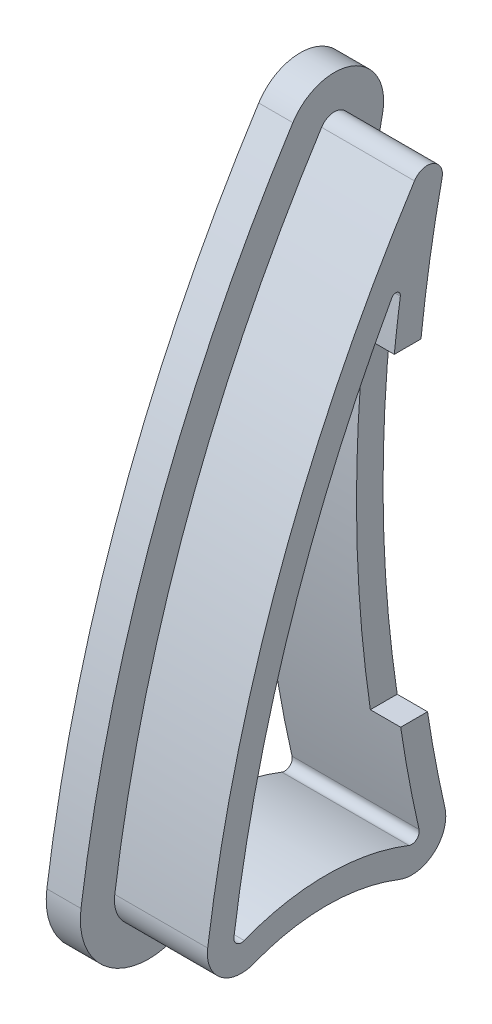
ISO-10303-21;
HEADER;
FILE_DESCRIPTION(('STEP AP214'),'2;1');
FILE_NAME('part.step','',(''),(''),'','','');
FILE_SCHEMA(('AUTOMOTIVE_DESIGN { 1 0 10303 214 1 1 1 1 }'));
ENDSEC;
DATA;
#1=APPLICATION_CONTEXT('core data for automotive mechanical design processes');
#2=APPLICATION_PROTOCOL_DEFINITION('international standard','automotive_design',2000,#1);
#3=PRODUCT_CONTEXT('',#1,'mechanical');
#4=PRODUCT('Part','Part','',(#3));
#5=PRODUCT_RELATED_PRODUCT_CATEGORY('part','',(#4));
#6=PRODUCT_DEFINITION_FORMATION('','',#4);
#7=PRODUCT_DEFINITION_CONTEXT('part definition',#1,'design');
#8=PRODUCT_DEFINITION('design','',#6,#7);
#9=PRODUCT_DEFINITION_SHAPE('','',#8);
#10=(LENGTH_UNIT() NAMED_UNIT(*) SI_UNIT(.MILLI.,.METRE.));
#11=(NAMED_UNIT(*) PLANE_ANGLE_UNIT() SI_UNIT($,.RADIAN.));
#12=(NAMED_UNIT(*) SI_UNIT($,.STERADIAN.) SOLID_ANGLE_UNIT());
#13=UNCERTAINTY_MEASURE_WITH_UNIT(LENGTH_MEASURE(1.E-05),#10,'distance_accuracy_value','');
#14=(GEOMETRIC_REPRESENTATION_CONTEXT(3) GLOBAL_UNCERTAINTY_ASSIGNED_CONTEXT((#13)) GLOBAL_UNIT_ASSIGNED_CONTEXT((#10,
#11,#12)) REPRESENTATION_CONTEXT('',''));
#15=CARTESIAN_POINT('',(0.,0.,0.));
#16=DIRECTION('',(0.,0.,1.));
#17=DIRECTION('',(1.,0.,0.));
#18=AXIS2_PLACEMENT_3D('',#15,#16,#17);
#19=CARTESIAN_POINT('',(0.,-6.20177657240364,-184.198856021998));
#20=DIRECTION('',(-1.,0.,0.));
#21=DIRECTION('',(0.,0.,-1.));
#22=AXIS2_PLACEMENT_3D('',#19,#20,#21);
#23=CYLINDRICAL_SURFACE('',#22,210.385678361767);
#24=CARTESIAN_POINT('',(-5.08,-6.20177657240364,-184.198856021998));
#25=DIRECTION('',(1.,0.,0.));
#26=DIRECTION('',(0.,0.,-1.));
#27=AXIS2_PLACEMENT_3D('',#24,#25,#26);
#28=CIRCLE('',#27,210.385678361767);
#29=CARTESIAN_POINT('',(-5.08,16.9330409285443,24.9109569446311));
#30=VERTEX_POINT('',#29);
#31=CARTESIAN_POINT('',(-5.08,-37.6769590714556,23.8190435597259));
#32=VERTEX_POINT('',#31);
#33=EDGE_CURVE('E331',#30,#32,#28,.T.);
#34=ORIENTED_EDGE('',*,*,#33,.T.);
#35=DIRECTION('',(-1.,0.,0.));
#36=VECTOR('',#35,1.);
#37=CARTESIAN_POINT('',(0.,-37.6769590714556,23.8190435597258));
#38=LINE('',#37,#36);
#39=CARTESIAN_POINT('',(0.,-37.6769590714556,23.8190435597259));
#40=VERTEX_POINT('',#39);
#41=EDGE_CURVE('E328',#40,#32,#38,.T.);
#42=ORIENTED_EDGE('',*,*,#41,.F.);
#43=CARTESIAN_POINT('',(0.,-6.20177657240364,-184.198856021998));
#44=DIRECTION('',(-1.,0.,0.));
#45=DIRECTION('',(0.,0.,-1.));
#46=AXIS2_PLACEMENT_3D('',#43,#44,#45);
#47=CIRCLE('',#46,210.385678361767);
#48=CARTESIAN_POINT('',(0.,-53.0579844312768,20.9026540768476));
#49=VERTEX_POINT('',#48);
#50=EDGE_CURVE('E247',#49,#40,#47,.T.);
#51=ORIENTED_EDGE('',*,*,#50,.F.);
#52=DIRECTION('',(-1.,0.,0.));
#53=VECTOR('',#52,1.);
#54=CARTESIAN_POINT('',(0.,-53.0579844312768,20.9026540768476));
#55=LINE('',#54,#53);
#56=CARTESIAN_POINT('',(-15.5575,-53.0579844312768,20.9026540768476));
#57=VERTEX_POINT('',#56);
#58=EDGE_CURVE('E285',#49,#57,#55,.T.);
#59=ORIENTED_EDGE('',*,*,#58,.T.);
#60=CARTESIAN_POINT('',(-15.5575,-6.20177657240364,-184.198856021998));
#61=DIRECTION('',(-1.,0.,0.));
#62=DIRECTION('',(0.,0.,-1.));
#63=AXIS2_PLACEMENT_3D('',#60,#61,#62);
#64=CIRCLE('',#63,210.385678361767);
#65=CARTESIAN_POINT('',(-15.5575,38.5039666862931,21.3821017037317));
#66=VERTEX_POINT('',#65);
#67=EDGE_CURVE('E270',#57,#66,#64,.T.);
#68=ORIENTED_EDGE('',*,*,#67,.T.);
#69=DIRECTION('',(-1.,0.,0.));
#70=VECTOR('',#69,1.);
#71=CARTESIAN_POINT('',(0.,38.5039666862931,21.3821017037317));
#72=LINE('',#71,#70);
#73=CARTESIAN_POINT('',(0.,38.5039666862931,21.3821017037317));
#74=VERTEX_POINT('',#73);
#75=EDGE_CURVE('E281',#74,#66,#72,.T.);
#76=ORIENTED_EDGE('',*,*,#75,.F.);
#77=CARTESIAN_POINT('',(0.,16.9330409285443,24.9109569446311));
#78=VERTEX_POINT('',#77);
#79=EDGE_CURVE('E246',#78,#74,#47,.T.);
#80=ORIENTED_EDGE('',*,*,#79,.F.);
#81=DIRECTION('',(-1.,0.,0.));
#82=VECTOR('',#81,1.);
#83=CARTESIAN_POINT('',(0.,16.9330409285443,24.9109569446311));
#84=LINE('',#83,#82);
#85=EDGE_CURVE('E324',#30,#78,#84,.F.);
#86=ORIENTED_EDGE('',*,*,#85,.F.);
#87=EDGE_LOOP('',(#34,#42,#51,#59,#68,#76,#80,#86));
#88=FACE_BOUND('',#87,.T.);
#89=ADVANCED_FACE('F44',(#88),#23,.F.);
#90=CARTESIAN_POINT('',(0.,-70.0279025216978,-58.2002153134541));
#91=DIRECTION('',(-1.,0.,0.));
#92=DIRECTION('',(0.,0.,-1.));
#93=AXIS2_PLACEMENT_3D('',#90,#91,#92);
#94=PLANE('',#93);
#95=DIRECTION('',(0.,0.,1.));
#96=VECTOR('',#95,1.);
#97=CARTESIAN_POINT('',(0.,16.9330409285443,11.4890333887427));
#98=LINE('',#97,#96);
#99=CARTESIAN_POINT('',(0.,16.9330409285443,29.3825115749315));
#100=VERTEX_POINT('',#99);
#101=EDGE_CURVE('E345',#78,#100,#98,.T.);
#102=ORIENTED_EDGE('',*,*,#101,.F.);
#103=ORIENTED_EDGE('',*,*,#79,.T.);
#104=CARTESIAN_POINT('',(0.,39.0437020369182,23.8640939984993));
#105=DIRECTION('',(1.,0.,0.));
#106=DIRECTION('',(0.,0.,-1.));
#107=AXIS2_PLACEMENT_3D('',#104,#105,#106);
#108=CIRCLE('',#107,2.54);
#109=CARTESIAN_POINT('',(0.,40.4114208380215,26.0044082934355));
#110=VERTEX_POINT('',#109);
#111=EDGE_CURVE('E251',#74,#110,#108,.T.);
#112=ORIENTED_EDGE('',*,*,#111,.T.);
#113=CARTESIAN_POINT('',(0.,-85.725,-171.383815377929));
#114=DIRECTION('',(1.,0.,0.));
#115=DIRECTION('',(0.,0.,-1.));
#116=AXIS2_PLACEMENT_3D('',#113,#114,#115);
#117=CIRCLE('',#116,234.248815377929);
#118=CARTESIAN_POINT('',(0.,-53.5457228712878,60.6442036832107));
#119=VERTEX_POINT('',#118);
#120=EDGE_CURVE('E230',#110,#119,#117,.T.);
#121=ORIENTED_EDGE('',*,*,#120,.T.);
#122=CARTESIAN_POINT('',(0.,-54.3308050433957,54.9833847510209));
#123=DIRECTION('',(1.,0.,0.));
#124=DIRECTION('',(0.,0.,-1.));
#125=AXIS2_PLACEMENT_3D('',#122,#123,#124);
#126=CIRCLE('',#125,5.715);
#127=CARTESIAN_POINT('',(0.,-59.6454053940841,52.8818976317499));
#128=VERTEX_POINT('',#127);
#129=EDGE_CURVE('E234',#119,#128,#126,.T.);
#130=ORIENTED_EDGE('',*,*,#129,.T.);
#131=CARTESIAN_POINT('',(0.,-90.380368501444,40.7287487928118));
#132=DIRECTION('',(-1.,0.,0.));
#133=DIRECTION('',(0.,0.,-1.));
#134=AXIS2_PLACEMENT_3D('',#131,#132,#133);
#135=CIRCLE('',#134,33.050521688956);
#136=CARTESIAN_POINT('',(0.,-59.6454053940841,28.5755999538737));
#137=VERTEX_POINT('',#136);
#138=EDGE_CURVE('E239',#128,#137,#135,.T.);
#139=ORIENTED_EDGE('',*,*,#138,.T.);
#140=CARTESIAN_POINT('',(0.,-54.3308050433957,26.4741128346026));
#141=DIRECTION('',(1.,0.,0.));
#142=DIRECTION('',(0.,0.,-1.));
#143=AXIS2_PLACEMENT_3D('',#140,#141,#142);
#144=CIRCLE('',#143,5.715);
#145=EDGE_CURVE('E243',#137,#49,#144,.T.);
#146=ORIENTED_EDGE('',*,*,#145,.T.);
#147=ORIENTED_EDGE('',*,*,#50,.T.);
#148=DIRECTION('',(0.,0.,-1.));
#149=VECTOR('',#148,1.);
#150=CARTESIAN_POINT('',(0.,-37.6769590714556,10.3217925721392));
#151=LINE('',#150,#149);
#152=CARTESIAN_POINT('',(0.,-37.6769590714555,28.3135747956562));
#153=VERTEX_POINT('',#152);
#154=EDGE_CURVE('E341',#153,#40,#151,.T.);
#155=ORIENTED_EDGE('',*,*,#154,.F.);
#156=CARTESIAN_POINT('',(0.,-6.20177657240364,-184.198856021998));
#157=DIRECTION('',(-1.,0.,0.));
#158=DIRECTION('',(0.,0.,-1.));
#159=AXIS2_PLACEMENT_3D('',#156,#157,#158);
#160=CIRCLE('',#159,214.830678361767);
#161=CARTESIAN_POINT('',(0.,-54.0479560184804,25.2360108884348));
#162=VERTEX_POINT('',#161);
#163=EDGE_CURVE('E219',#162,#153,#160,.T.);
#164=ORIENTED_EDGE('',*,*,#163,.F.);
#165=CARTESIAN_POINT('',(0.,-54.3308050433957,26.4741128346026));
#166=DIRECTION('',(1.,0.,0.));
#167=DIRECTION('',(0.,0.,-1.));
#168=AXIS2_PLACEMENT_3D('',#165,#166,#167);
#169=CIRCLE('',#168,1.27);
#170=CARTESIAN_POINT('',(0.,-55.5118273435487,26.9411099722184));
#171=VERTEX_POINT('',#170);
#172=EDGE_CURVE('E312',#171,#162,#169,.T.);
#173=ORIENTED_EDGE('',*,*,#172,.F.);
#174=CARTESIAN_POINT('',(0.,-90.380368501444,40.7287487928118));
#175=DIRECTION('',(-1.,0.,0.));
#176=DIRECTION('',(0.,0.,-1.));
#177=AXIS2_PLACEMENT_3D('',#174,#175,#176);
#178=CIRCLE('',#177,37.495521688956);
#179=CARTESIAN_POINT('',(0.,-55.5118273435487,54.5163876134051));
#180=VERTEX_POINT('',#179);
#181=EDGE_CURVE('E316',#180,#171,#178,.T.);
#182=ORIENTED_EDGE('',*,*,#181,.F.);
#183=CARTESIAN_POINT('',(0.,-54.3308050433957,54.9833847510209));
#184=DIRECTION('',(1.,0.,0.));
#185=DIRECTION('',(0.,0.,-1.));
#186=AXIS2_PLACEMENT_3D('',#183,#184,#185);
#187=CIRCLE('',#186,1.27);
#188=CARTESIAN_POINT('',(0.,-54.1563423384828,56.2413445137298));
#189=VERTEX_POINT('',#188);
#190=EDGE_CURVE('E319',#189,#180,#187,.T.);
#191=ORIENTED_EDGE('',*,*,#190,.F.);
#192=CARTESIAN_POINT('',(0.,-85.725,-171.383815377929));
#193=DIRECTION('',(1.,0.,0.));
#194=DIRECTION('',(0.,0.,-1.));
#195=AXIS2_PLACEMENT_3D('',#192,#193,#194);
#196=CIRCLE('',#195,229.803815377929);
#197=CARTESIAN_POINT('',(0.,25.3482363803248,29.794040566143));
#198=VERTEX_POINT('',#197);
#199=EDGE_CURVE('E216',#198,#189,#196,.T.);
#200=ORIENTED_EDGE('',*,*,#199,.F.);
#201=CARTESIAN_POINT('',(0.,24.9799317636994,29.1269605789057));
#202=DIRECTION('',(1.,0.,0.));
#203=DIRECTION('',(0.,0.,-1.));
#204=AXIS2_PLACEMENT_3D('',#201,#202,#203);
#205=CIRCLE('',#204,0.762);
#206=CARTESIAN_POINT('',(0.,24.8697217976994,28.3729726722427));
#207=VERTEX_POINT('',#206);
#208=EDGE_CURVE('E11',#207,#198,#205,.T.);
#209=ORIENTED_EDGE('',*,*,#208,.F.);
#210=EDGE_CURVE('E226',#100,#207,#160,.T.);
#211=ORIENTED_EDGE('',*,*,#210,.F.);
#212=EDGE_LOOP('',(#102,#103,#112,#121,#130,#139,#146,#147,#155,#164,#173,#182,#191,#200,#209,#211));
#213=FACE_BOUND('',#212,.T.);
#214=ADVANCED_FACE('F445',(#213),#94,.F.);
#215=CARTESIAN_POINT('',(0.,-6.20177657240364,-184.198856021998));
#216=DIRECTION('',(-1.,0.,0.));
#217=DIRECTION('',(0.,0.,-1.));
#218=AXIS2_PLACEMENT_3D('',#215,#216,#217);
#219=CYLINDRICAL_SURFACE('',#218,214.830678361767);
#220=DIRECTION('',(1.,0.,0.));
#221=VECTOR('',#220,1.);
#222=CARTESIAN_POINT('',(-5.08,16.9330409285443,29.3825115749315));
#223=LINE('',#222,#221);
#224=CARTESIAN_POINT('',(-5.08,16.9330409285443,29.3825115749315));
#225=VERTEX_POINT('',#224);
#226=EDGE_CURVE('E335',#225,#100,#223,.T.);
#227=ORIENTED_EDGE('',*,*,#226,.T.);
#228=ORIENTED_EDGE('',*,*,#210,.T.);
#229=DIRECTION('',(-1.,0.,0.));
#230=VECTOR('',#229,1.);
#231=CARTESIAN_POINT('',(0.,24.8697217976994,28.3729726722426));
#232=LINE('',#231,#230);
#233=CARTESIAN_POINT('',(-21.2725,24.8697217976994,28.3729726722426));
#234=VERTEX_POINT('',#233);
#235=EDGE_CURVE('E53',#234,#207,#232,.F.);
#236=ORIENTED_EDGE('',*,*,#235,.F.);
#237=CARTESIAN_POINT('',(-21.2725,-6.20177657240364,-184.198856021998));
#238=DIRECTION('',(-1.,0.,0.));
#239=DIRECTION('',(0.,0.,-1.));
#240=AXIS2_PLACEMENT_3D('',#237,#238,#239);
#241=CIRCLE('',#240,214.830678361767);
#242=CARTESIAN_POINT('',(-21.2725,-54.0479560184804,25.2360108884348));
#243=VERTEX_POINT('',#242);
#244=EDGE_CURVE('E424',#243,#234,#241,.T.);
#245=ORIENTED_EDGE('',*,*,#244,.F.);
#246=DIRECTION('',(-1.,0.,0.));
#247=VECTOR('',#246,1.);
#248=CARTESIAN_POINT('',(0.,-54.0479560184804,25.2360108884348));
#249=LINE('',#248,#247);
#250=EDGE_CURVE('E261',#162,#243,#249,.T.);
#251=ORIENTED_EDGE('',*,*,#250,.F.);
#252=ORIENTED_EDGE('',*,*,#163,.T.);
#253=DIRECTION('',(1.,0.,0.));
#254=VECTOR('',#253,1.);
#255=CARTESIAN_POINT('',(-5.08,-37.6769590714555,28.3135747956562));
#256=LINE('',#255,#254);
#257=CARTESIAN_POINT('',(-5.08,-37.6769590714555,28.3135747956562));
#258=VERTEX_POINT('',#257);
#259=EDGE_CURVE('E338',#258,#153,#256,.T.);
#260=ORIENTED_EDGE('',*,*,#259,.F.);
#261=CARTESIAN_POINT('',(-5.08,-6.20177657240364,-184.198856021998));
#262=DIRECTION('',(1.,0.,0.));
#263=DIRECTION('',(0.,0.,-1.));
#264=AXIS2_PLACEMENT_3D('',#261,#262,#263);
#265=CIRCLE('',#264,214.830678361767);
#266=EDGE_CURVE('E352',#225,#258,#265,.T.);
#267=ORIENTED_EDGE('',*,*,#266,.F.);
#268=EDGE_LOOP('',(#227,#228,#236,#245,#251,#252,#260,#267));
#269=FACE_BOUND('',#268,.T.);
#270=ADVANCED_FACE('F438',(#269),#219,.T.);
#271=CARTESIAN_POINT('',(0.,-85.725,-171.383815377929));
#272=DIRECTION('',(-1.,0.,0.));
#273=DIRECTION('',(0.,0.,-1.));
#274=AXIS2_PLACEMENT_3D('',#271,#272,#273);
#275=CYLINDRICAL_SURFACE('',#274,234.248815377929);
#276=CARTESIAN_POINT('',(-15.5575,-85.725,-171.383815377929));
#277=DIRECTION('',(1.,0.,0.));
#278=DIRECTION('',(0.,0.,-1.));
#279=AXIS2_PLACEMENT_3D('',#276,#277,#278);
#280=CIRCLE('',#279,234.248815377929);
#281=CARTESIAN_POINT('',(-15.5575,40.4114208380215,26.0044082934355));
#282=VERTEX_POINT('',#281);
#283=CARTESIAN_POINT('',(-15.5575,-53.5457228712878,60.6442036832107));
#284=VERTEX_POINT('',#283);
#285=EDGE_CURVE('E256',#282,#284,#280,.T.);
#286=ORIENTED_EDGE('',*,*,#285,.T.);
#287=DIRECTION('',(-1.,0.,0.));
#288=VECTOR('',#287,1.);
#289=CARTESIAN_POINT('',(0.,-53.5457228712878,60.6442036832107));
#290=LINE('',#289,#288);
#291=EDGE_CURVE('E255',#119,#284,#290,.T.);
#292=ORIENTED_EDGE('',*,*,#291,.F.);
#293=ORIENTED_EDGE('',*,*,#120,.F.);
#294=DIRECTION('',(-1.,0.,0.));
#295=VECTOR('',#294,1.);
#296=CARTESIAN_POINT('',(0.,40.4114208380215,26.0044082934355));
#297=LINE('',#296,#295);
#298=EDGE_CURVE('E276',#110,#282,#297,.T.);
#299=ORIENTED_EDGE('',*,*,#298,.T.);
#300=EDGE_LOOP('',(#286,#292,#293,#299));
#301=FACE_BOUND('',#300,.T.);
#302=ADVANCED_FACE('F478',(#301),#275,.T.);
#303=CARTESIAN_POINT('',(0.,39.0437020369182,23.8640939984993));
#304=DIRECTION('',(-1.,0.,0.));
#305=DIRECTION('',(0.,0.,-1.));
#306=AXIS2_PLACEMENT_3D('',#303,#304,#305);
#307=CYLINDRICAL_SURFACE('',#306,2.54);
#308=CARTESIAN_POINT('',(-15.5575,39.0437020369182,23.8640939984993));
#309=DIRECTION('',(1.,0.,0.));
#310=DIRECTION('',(0.,0.,-1.));
#311=AXIS2_PLACEMENT_3D('',#308,#309,#310);
#312=CIRCLE('',#311,2.54);
#313=EDGE_CURVE('E235',#66,#282,#312,.T.);
#314=ORIENTED_EDGE('',*,*,#313,.T.);
#315=ORIENTED_EDGE('',*,*,#298,.F.);
#316=ORIENTED_EDGE('',*,*,#111,.F.);
#317=ORIENTED_EDGE('',*,*,#75,.T.);
#318=EDGE_LOOP('',(#314,#315,#316,#317));
#319=FACE_BOUND('',#318,.T.);
#320=ADVANCED_FACE('F466',(#319),#307,.T.);
#321=CARTESIAN_POINT('',(0.,-54.3308050433957,26.4741128346026));
#322=DIRECTION('',(-1.,0.,0.));
#323=DIRECTION('',(0.,0.,-1.));
#324=AXIS2_PLACEMENT_3D('',#321,#322,#323);
#325=CYLINDRICAL_SURFACE('',#324,5.715);
#326=CARTESIAN_POINT('',(-15.5575,-54.3308050433957,26.4741128346026));
#327=DIRECTION('',(1.,0.,0.));
#328=DIRECTION('',(0.,0.,-1.));
#329=AXIS2_PLACEMENT_3D('',#326,#327,#328);
#330=CIRCLE('',#329,5.715);
#331=CARTESIAN_POINT('',(-15.5575,-59.6454053940841,28.5755999538737));
#332=VERTEX_POINT('',#331);
#333=EDGE_CURVE('E267',#332,#57,#330,.T.);
#334=ORIENTED_EDGE('',*,*,#333,.T.);
#335=ORIENTED_EDGE('',*,*,#58,.F.);
#336=ORIENTED_EDGE('',*,*,#145,.F.);
#337=DIRECTION('',(-1.,0.,0.));
#338=VECTOR('',#337,1.);
#339=CARTESIAN_POINT('',(0.,-59.6454053940841,28.5755999538737));
#340=LINE('',#339,#338);
#341=EDGE_CURVE('E289',#137,#332,#340,.T.);
#342=ORIENTED_EDGE('',*,*,#341,.T.);
#343=EDGE_LOOP('',(#334,#335,#336,#342));
#344=FACE_BOUND('',#343,.T.);
#345=ADVANCED_FACE('F467',(#344),#325,.T.);
#346=CARTESIAN_POINT('',(0.,-90.380368501444,40.7287487928118));
#347=DIRECTION('',(-1.,0.,0.));
#348=DIRECTION('',(0.,0.,-1.));
#349=AXIS2_PLACEMENT_3D('',#346,#347,#348);
#350=CYLINDRICAL_SURFACE('',#349,33.050521688956);
#351=CARTESIAN_POINT('',(-15.5575,-90.380368501444,40.7287487928118));
#352=DIRECTION('',(-1.,0.,0.));
#353=DIRECTION('',(0.,0.,-1.));
#354=AXIS2_PLACEMENT_3D('',#351,#352,#353);
#355=CIRCLE('',#354,33.050521688956);
#356=CARTESIAN_POINT('',(-15.5575,-59.6454053940841,52.8818976317499));
#357=VERTEX_POINT('',#356);
#358=EDGE_CURVE('E264',#357,#332,#355,.T.);
#359=ORIENTED_EDGE('',*,*,#358,.T.);
#360=ORIENTED_EDGE('',*,*,#341,.F.);
#361=ORIENTED_EDGE('',*,*,#138,.F.);
#362=DIRECTION('',(-1.,0.,0.));
#363=VECTOR('',#362,1.);
#364=CARTESIAN_POINT('',(0.,-59.6454053940841,52.8818976317499));
#365=LINE('',#364,#363);
#366=EDGE_CURVE('E293',#128,#357,#365,.T.);
#367=ORIENTED_EDGE('',*,*,#366,.T.);
#368=EDGE_LOOP('',(#359,#360,#361,#367));
#369=FACE_BOUND('',#368,.T.);
#370=ADVANCED_FACE('F470',(#369),#350,.F.);
#371=CARTESIAN_POINT('',(0.,-54.3308050433957,54.9833847510209));
#372=DIRECTION('',(-1.,0.,0.));
#373=DIRECTION('',(0.,0.,-1.));
#374=AXIS2_PLACEMENT_3D('',#371,#372,#373);
#375=CYLINDRICAL_SURFACE('',#374,5.715);
#376=CARTESIAN_POINT('',(-15.5575,-54.3308050433957,54.9833847510209));
#377=DIRECTION('',(1.,0.,0.));
#378=DIRECTION('',(0.,0.,-1.));
#379=AXIS2_PLACEMENT_3D('',#376,#377,#378);
#380=CIRCLE('',#379,5.715);
#381=EDGE_CURVE('E260',#284,#357,#380,.T.);
#382=ORIENTED_EDGE('',*,*,#381,.T.);
#383=ORIENTED_EDGE('',*,*,#366,.F.);
#384=ORIENTED_EDGE('',*,*,#129,.F.);
#385=ORIENTED_EDGE('',*,*,#291,.T.);
#386=EDGE_LOOP('',(#382,#383,#384,#385));
#387=FACE_BOUND('',#386,.T.);
#388=ADVANCED_FACE('F474',(#387),#375,.T.);
#389=CARTESIAN_POINT('',(0.,-85.725,-171.383815377929));
#390=DIRECTION('',(-1.,0.,0.));
#391=DIRECTION('',(0.,0.,-1.));
#392=AXIS2_PLACEMENT_3D('',#389,#390,#391);
#393=CYLINDRICAL_SURFACE('',#392,229.803815377929);
#394=ORIENTED_EDGE('',*,*,#199,.T.);
#395=DIRECTION('',(-1.,0.,0.));
#396=VECTOR('',#395,1.);
#397=CARTESIAN_POINT('',(0.,-54.1563423384828,56.2413445137298));
#398=LINE('',#397,#396);
#399=CARTESIAN_POINT('',(-21.2725,-54.1563423384828,56.2413445137298));
#400=VERTEX_POINT('',#399);
#401=EDGE_CURVE('E197',#189,#400,#398,.T.);
#402=ORIENTED_EDGE('',*,*,#401,.T.);
#403=CARTESIAN_POINT('',(-21.2725,-85.725,-171.383815377929));
#404=DIRECTION('',(1.,0.,0.));
#405=DIRECTION('',(0.,0.,-1.));
#406=AXIS2_PLACEMENT_3D('',#403,#404,#405);
#407=CIRCLE('',#406,229.803815377929);
#408=CARTESIAN_POINT('',(-21.2725,25.3482363803248,29.794040566143));
#409=VERTEX_POINT('',#408);
#410=EDGE_CURVE('E204',#409,#400,#407,.T.);
#411=ORIENTED_EDGE('',*,*,#410,.F.);
#412=DIRECTION('',(-1.,0.,0.));
#413=VECTOR('',#412,1.);
#414=CARTESIAN_POINT('',(0.,25.3482363803248,29.794040566143));
#415=LINE('',#414,#413);
#416=EDGE_CURVE('E280',#198,#409,#415,.T.);
#417=ORIENTED_EDGE('',*,*,#416,.F.);
#418=EDGE_LOOP('',(#394,#402,#411,#417));
#419=FACE_BOUND('',#418,.T.);
#420=ADVANCED_FACE('F214',(#419),#393,.F.);
#421=CARTESIAN_POINT('',(0.,-54.3308050433957,26.4741128346026));
#422=DIRECTION('',(-1.,0.,0.));
#423=DIRECTION('',(0.,0.,-1.));
#424=AXIS2_PLACEMENT_3D('',#421,#422,#423);
#425=CYLINDRICAL_SURFACE('',#424,1.27);
#426=DIRECTION('',(-1.,0.,0.));
#427=VECTOR('',#426,1.);
#428=CARTESIAN_POINT('',(0.,-55.5118273435487,26.9411099722184));
#429=LINE('',#428,#427);
#430=CARTESIAN_POINT('',(-21.2725,-55.5118273435487,26.9411099722184));
#431=VERTEX_POINT('',#430);
#432=EDGE_CURVE('E223',#171,#431,#429,.T.);
#433=ORIENTED_EDGE('',*,*,#432,.F.);
#434=ORIENTED_EDGE('',*,*,#172,.T.);
#435=ORIENTED_EDGE('',*,*,#250,.T.);
#436=CARTESIAN_POINT('',(-21.2725,-54.3308050433957,26.4741128346026));
#437=DIRECTION('',(1.,0.,0.));
#438=DIRECTION('',(0.,0.,-1.));
#439=AXIS2_PLACEMENT_3D('',#436,#437,#438);
#440=CIRCLE('',#439,1.27);
#441=EDGE_CURVE('E427',#431,#243,#440,.T.);
#442=ORIENTED_EDGE('',*,*,#441,.F.);
#443=EDGE_LOOP('',(#433,#434,#435,#442));
#444=FACE_BOUND('',#443,.T.);
#445=ADVANCED_FACE('F433',(#444),#425,.F.);
#446=CARTESIAN_POINT('',(0.,-90.380368501444,40.7287487928118));
#447=DIRECTION('',(-1.,0.,0.));
#448=DIRECTION('',(0.,0.,-1.));
#449=AXIS2_PLACEMENT_3D('',#446,#447,#448);
#450=CYLINDRICAL_SURFACE('',#449,37.495521688956);
#451=DIRECTION('',(-1.,0.,0.));
#452=VECTOR('',#451,1.);
#453=CARTESIAN_POINT('',(0.,-55.5118273435487,54.5163876134051));
#454=LINE('',#453,#452);
#455=CARTESIAN_POINT('',(-21.2725,-55.5118273435487,54.5163876134051));
#456=VERTEX_POINT('',#455);
#457=EDGE_CURVE('E199',#180,#456,#454,.T.);
#458=ORIENTED_EDGE('',*,*,#457,.F.);
#459=ORIENTED_EDGE('',*,*,#181,.T.);
#460=ORIENTED_EDGE('',*,*,#432,.T.);
#461=CARTESIAN_POINT('',(-21.2725,-90.380368501444,40.7287487928118));
#462=DIRECTION('',(-1.,0.,0.));
#463=DIRECTION('',(0.,0.,-1.));
#464=AXIS2_PLACEMENT_3D('',#461,#462,#463);
#465=CIRCLE('',#464,37.495521688956);
#466=EDGE_CURVE('E203',#456,#431,#465,.T.);
#467=ORIENTED_EDGE('',*,*,#466,.F.);
#468=EDGE_LOOP('',(#458,#459,#460,#467));
#469=FACE_BOUND('',#468,.T.);
#470=ADVANCED_FACE('F455',(#469),#450,.T.);
#471=CARTESIAN_POINT('',(0.,-54.3308050433957,54.9833847510209));
#472=DIRECTION('',(-1.,0.,0.));
#473=DIRECTION('',(0.,0.,-1.));
#474=AXIS2_PLACEMENT_3D('',#471,#472,#473);
#475=CYLINDRICAL_SURFACE('',#474,1.27);
#476=ORIENTED_EDGE('',*,*,#401,.F.);
#477=ORIENTED_EDGE('',*,*,#190,.T.);
#478=ORIENTED_EDGE('',*,*,#457,.T.);
#479=CARTESIAN_POINT('',(-21.2725,-54.3308050433957,54.9833847510209));
#480=DIRECTION('',(1.,0.,0.));
#481=DIRECTION('',(0.,0.,-1.));
#482=AXIS2_PLACEMENT_3D('',#479,#480,#481);
#483=CIRCLE('',#482,1.27);
#484=EDGE_CURVE('E192',#400,#456,#483,.T.);
#485=ORIENTED_EDGE('',*,*,#484,.F.);
#486=EDGE_LOOP('',(#476,#477,#478,#485));
#487=FACE_BOUND('',#486,.T.);
#488=ADVANCED_FACE('F194',(#487),#475,.F.);
#489=CARTESIAN_POINT('',(0.,24.9799317636994,29.1269605789057));
#490=DIRECTION('',(-1.,0.,0.));
#491=DIRECTION('',(0.,0.,-1.));
#492=AXIS2_PLACEMENT_3D('',#489,#490,#491);
#493=CYLINDRICAL_SURFACE('',#492,0.762);
#494=ORIENTED_EDGE('',*,*,#208,.T.);
#495=ORIENTED_EDGE('',*,*,#416,.T.);
#496=CARTESIAN_POINT('',(-21.2725,24.9799317636994,29.1269605789057));
#497=DIRECTION('',(1.,0.,0.));
#498=DIRECTION('',(0.,0.,-1.));
#499=AXIS2_PLACEMENT_3D('',#496,#497,#498);
#500=CIRCLE('',#499,0.761999999999986);
#501=EDGE_CURVE('E209',#234,#409,#500,.T.);
#502=ORIENTED_EDGE('',*,*,#501,.F.);
#503=ORIENTED_EDGE('',*,*,#235,.T.);
#504=EDGE_LOOP('',(#494,#495,#502,#503));
#505=FACE_BOUND('',#504,.T.);
#506=ADVANCED_FACE('F46',(#505),#493,.F.);
#507=CARTESIAN_POINT('',(-5.08,16.9330409285443,11.4890333887427));
#508=DIRECTION('',(0.,-1.,0.));
#509=DIRECTION('',(0.,0.,-1.));
#510=AXIS2_PLACEMENT_3D('',#507,#508,#509);
#511=PLANE('',#510);
#512=DIRECTION('',(0.,0.,1.));
#513=VECTOR('',#512,1.);
#514=CARTESIAN_POINT('',(-5.08,16.9330409285443,11.4890333887427));
#515=LINE('',#514,#513);
#516=EDGE_CURVE('E344',#30,#225,#515,.T.);
#517=ORIENTED_EDGE('',*,*,#516,.F.);
#518=ORIENTED_EDGE('',*,*,#85,.T.);
#519=ORIENTED_EDGE('',*,*,#101,.T.);
#520=ORIENTED_EDGE('',*,*,#226,.F.);
#521=EDGE_LOOP('',(#517,#518,#519,#520));
#522=FACE_BOUND('',#521,.T.);
#523=ADVANCED_FACE('F447',(#522),#511,.T.);
#524=CARTESIAN_POINT('',(-5.08,-37.6769590714556,10.3217925721392));
#525=DIRECTION('',(0.,1.,0.));
#526=DIRECTION('',(0.,0.,1.));
#527=AXIS2_PLACEMENT_3D('',#524,#525,#526);
#528=PLANE('',#527);
#529=ORIENTED_EDGE('',*,*,#154,.T.);
#530=ORIENTED_EDGE('',*,*,#41,.T.);
#531=DIRECTION('',(0.,0.,-1.));
#532=VECTOR('',#531,1.);
#533=CARTESIAN_POINT('',(-5.08,-37.6769590714556,10.3217925721392));
#534=LINE('',#533,#532);
#535=EDGE_CURVE('E60',#258,#32,#534,.T.);
#536=ORIENTED_EDGE('',*,*,#535,.F.);
#537=ORIENTED_EDGE('',*,*,#259,.T.);
#538=EDGE_LOOP('',(#529,#530,#536,#537));
#539=FACE_BOUND('',#538,.T.);
#540=ADVANCED_FACE('F452',(#539),#528,.T.);
#541=CARTESIAN_POINT('',(-5.08,-6.20177657240364,-184.198856021998));
#542=DIRECTION('',(-1.,0.,0.));
#543=DIRECTION('',(0.,0.,-1.));
#544=AXIS2_PLACEMENT_3D('',#541,#542,#543);
#545=PLANE('',#544);
#546=ORIENTED_EDGE('',*,*,#33,.F.);
#547=ORIENTED_EDGE('',*,*,#516,.T.);
#548=ORIENTED_EDGE('',*,*,#266,.T.);
#549=ORIENTED_EDGE('',*,*,#535,.T.);
#550=EDGE_LOOP('',(#546,#547,#548,#549));
#551=FACE_BOUND('',#550,.T.);
#552=ADVANCED_FACE('F571',(#551),#545,.F.);
#553=CARTESIAN_POINT('',(-21.2725,-23.3406489815409,-73.7598606897149));
#554=DIRECTION('',(-1.,0.,0.));
#555=DIRECTION('',(0.,0.,-1.));
#556=AXIS2_PLACEMENT_3D('',#553,#554,#555);
#557=PLANE('',#556);
#558=CARTESIAN_POINT('',(-21.2725,39.0437020369182,23.8640939984993));
#559=DIRECTION('',(1.,0.,0.));
#560=DIRECTION('',(0.,0.,-1.));
#561=AXIS2_PLACEMENT_3D('',#558,#559,#560);
#562=CIRCLE('',#561,8.25499999999998);
#563=CARTESIAN_POINT('',(-21.2725,37.2895621473866,15.7976190405047));
#564=VERTEX_POINT('',#563);
#565=CARTESIAN_POINT('',(-21.2725,43.4887881405039,30.8201154570421));
#566=VERTEX_POINT('',#565);
#567=EDGE_CURVE('E379',#564,#566,#562,.T.);
#568=ORIENTED_EDGE('',*,*,#567,.F.);
#569=CARTESIAN_POINT('',(-21.2725,-6.20177657240364,-184.198856021998));
#570=DIRECTION('',(-1.,0.,0.));
#571=DIRECTION('',(0.,0.,-1.));
#572=AXIS2_PLACEMENT_3D('',#569,#570,#571);
#573=CIRCLE('',#572,204.670678361767);
#574=CARTESIAN_POINT('',(-21.2725,-51.7851638191579,15.3311953190925));
#575=VERTEX_POINT('',#574);
#576=EDGE_CURVE('E374',#575,#564,#573,.T.);
#577=ORIENTED_EDGE('',*,*,#576,.F.);
#578=CARTESIAN_POINT('',(-21.2725,-54.3308050433957,26.4741128346026));
#579=DIRECTION('',(1.,0.,0.));
#580=DIRECTION('',(0.,0.,-1.));
#581=AXIS2_PLACEMENT_3D('',#578,#579,#580);
#582=CIRCLE('',#581,11.43);
#583=CARTESIAN_POINT('',(-21.2725,-64.9600057447726,30.6770870731448));
#584=VERTEX_POINT('',#583);
#585=EDGE_CURVE('E403',#584,#575,#582,.T.);
#586=ORIENTED_EDGE('',*,*,#585,.F.);
#587=CARTESIAN_POINT('',(-21.2725,-90.380368501444,40.7287487928118));
#588=DIRECTION('',(-1.,0.,0.));
#589=DIRECTION('',(0.,0.,-1.));
#590=AXIS2_PLACEMENT_3D('',#587,#588,#589);
#591=CIRCLE('',#590,27.335521688956);
#592=CARTESIAN_POINT('',(-21.2725,-64.9600057447726,50.7804105124788));
#593=VERTEX_POINT('',#592);
#594=EDGE_CURVE('E407',#593,#584,#591,.T.);
#595=ORIENTED_EDGE('',*,*,#594,.F.);
#596=CARTESIAN_POINT('',(-21.2725,-54.3308050433957,54.9833847510209));
#597=DIRECTION('',(1.,0.,0.));
#598=DIRECTION('',(0.,0.,-1.));
#599=AXIS2_PLACEMENT_3D('',#596,#597,#598);
#600=CIRCLE('',#599,11.43);
#601=CARTESIAN_POINT('',(-21.2725,-52.76064069918,66.3050226154005));
#602=VERTEX_POINT('',#601);
#603=EDGE_CURVE('E411',#602,#593,#600,.T.);
#604=ORIENTED_EDGE('',*,*,#603,.F.);
#605=CARTESIAN_POINT('',(-21.2725,-85.725,-171.383815377929));
#606=DIRECTION('',(1.,0.,0.));
#607=DIRECTION('',(0.,0.,-1.));
#608=AXIS2_PLACEMENT_3D('',#605,#606,#607);
#609=CIRCLE('',#608,239.963815377929);
#610=EDGE_CURVE('E415',#566,#602,#609,.T.);
#611=ORIENTED_EDGE('',*,*,#610,.F.);
#612=EDGE_LOOP('',(#568,#577,#586,#595,#604,#611));
#613=FACE_BOUND('',#612,.T.);
#614=ORIENTED_EDGE('',*,*,#484,.T.);
#615=ORIENTED_EDGE('',*,*,#466,.T.);
#616=ORIENTED_EDGE('',*,*,#441,.T.);
#617=ORIENTED_EDGE('',*,*,#244,.T.);
#618=ORIENTED_EDGE('',*,*,#501,.T.);
#619=ORIENTED_EDGE('',*,*,#410,.T.);
#620=EDGE_LOOP('',(#614,#615,#616,#617,#618,#619));
#621=FACE_BOUND('',#620,.T.);
#622=ADVANCED_FACE('F207',(#613,#621),#557,.T.);
#623=CARTESIAN_POINT('',(-15.5575,-23.3406489815409,-73.7598606897149));
#624=DIRECTION('',(-1.,0.,0.));
#625=DIRECTION('',(0.,0.,-1.));
#626=AXIS2_PLACEMENT_3D('',#623,#624,#625);
#627=PLANE('',#626);
#628=ORIENTED_EDGE('',*,*,#313,.F.);
#629=ORIENTED_EDGE('',*,*,#67,.F.);
#630=ORIENTED_EDGE('',*,*,#333,.F.);
#631=ORIENTED_EDGE('',*,*,#358,.F.);
#632=ORIENTED_EDGE('',*,*,#381,.F.);
#633=ORIENTED_EDGE('',*,*,#285,.F.);
#634=EDGE_LOOP('',(#628,#629,#630,#631,#632,#633));
#635=FACE_BOUND('',#634,.T.);
#636=CARTESIAN_POINT('',(-15.5575,39.0437020369182,23.8640939984993));
#637=DIRECTION('',(1.,0.,0.));
#638=DIRECTION('',(0.,0.,-1.));
#639=AXIS2_PLACEMENT_3D('',#636,#637,#638);
#640=CIRCLE('',#639,8.25499999999998);
#641=CARTESIAN_POINT('',(-15.5575,37.2895621473866,15.7976190405047));
#642=VERTEX_POINT('',#641);
#643=CARTESIAN_POINT('',(-15.5575,43.4887881405039,30.8201154570421));
#644=VERTEX_POINT('',#643);
#645=EDGE_CURVE('E396',#642,#644,#640,.T.);
#646=ORIENTED_EDGE('',*,*,#645,.T.);
#647=CARTESIAN_POINT('',(-15.5575,-85.725,-171.383815377929));
#648=DIRECTION('',(1.,0.,0.));
#649=DIRECTION('',(0.,0.,-1.));
#650=AXIS2_PLACEMENT_3D('',#647,#648,#649);
#651=CIRCLE('',#650,239.963815377929);
#652=CARTESIAN_POINT('',(-15.5575,-52.76064069918,66.3050226154005));
#653=VERTEX_POINT('',#652);
#654=EDGE_CURVE('E392',#644,#653,#651,.T.);
#655=ORIENTED_EDGE('',*,*,#654,.T.);
#656=CARTESIAN_POINT('',(-15.5575,-54.3308050433957,54.9833847510209));
#657=DIRECTION('',(1.,0.,0.));
#658=DIRECTION('',(0.,0.,-1.));
#659=AXIS2_PLACEMENT_3D('',#656,#657,#658);
#660=CIRCLE('',#659,11.43);
#661=CARTESIAN_POINT('',(-15.5575,-64.9600057447726,50.7804105124788));
#662=VERTEX_POINT('',#661);
#663=EDGE_CURVE('E388',#653,#662,#660,.T.);
#664=ORIENTED_EDGE('',*,*,#663,.T.);
#665=CARTESIAN_POINT('',(-15.5575,-90.380368501444,40.7287487928118));
#666=DIRECTION('',(-1.,0.,0.));
#667=DIRECTION('',(0.,0.,-1.));
#668=AXIS2_PLACEMENT_3D('',#665,#666,#667);
#669=CIRCLE('',#668,27.335521688956);
#670=CARTESIAN_POINT('',(-15.5575,-64.9600057447726,30.6770870731448));
#671=VERTEX_POINT('',#670);
#672=EDGE_CURVE('E384',#662,#671,#669,.T.);
#673=ORIENTED_EDGE('',*,*,#672,.T.);
#674=CARTESIAN_POINT('',(-15.5575,-54.3308050433957,26.4741128346026));
#675=DIRECTION('',(1.,0.,0.));
#676=DIRECTION('',(0.,0.,-1.));
#677=AXIS2_PLACEMENT_3D('',#674,#675,#676);
#678=CIRCLE('',#677,11.43);
#679=CARTESIAN_POINT('',(-15.5575,-51.7851638191579,15.3311953190925));
#680=VERTEX_POINT('',#679);
#681=EDGE_CURVE('E380',#671,#680,#678,.T.);
#682=ORIENTED_EDGE('',*,*,#681,.T.);
#683=CARTESIAN_POINT('',(-15.5575,-6.20177657240364,-184.198856021998));
#684=DIRECTION('',(-1.,0.,0.));
#685=DIRECTION('',(0.,0.,-1.));
#686=AXIS2_PLACEMENT_3D('',#683,#684,#685);
#687=CIRCLE('',#686,204.670678361767);
#688=EDGE_CURVE('E375',#680,#642,#687,.T.);
#689=ORIENTED_EDGE('',*,*,#688,.T.);
#690=EDGE_LOOP('',(#646,#655,#664,#673,#682,#689));
#691=FACE_BOUND('',#690,.T.);
#692=ADVANCED_FACE('F491',(#635,#691),#627,.F.);
#693=CARTESIAN_POINT('',(-21.2725,39.0437020369182,23.8640939984993));
#694=DIRECTION('',(1.,0.,0.));
#695=DIRECTION('',(0.,0.,1.));
#696=AXIS2_PLACEMENT_3D('',#693,#694,#695);
#697=CYLINDRICAL_SURFACE('',#696,8.25499999999998);
#698=ORIENTED_EDGE('',*,*,#645,.F.);
#699=DIRECTION('',(1.,0.,0.));
#700=VECTOR('',#699,1.);
#701=CARTESIAN_POINT('',(-21.2725,37.2895621473866,15.7976190405047));
#702=LINE('',#701,#700);
#703=EDGE_CURVE('E371',#564,#642,#702,.T.);
#704=ORIENTED_EDGE('',*,*,#703,.F.);
#705=ORIENTED_EDGE('',*,*,#567,.T.);
#706=DIRECTION('',(1.,0.,0.));
#707=VECTOR('',#706,1.);
#708=CARTESIAN_POINT('',(-21.2725,43.4887881405039,30.8201154570421));
#709=LINE('',#708,#707);
#710=EDGE_CURVE('E349',#566,#644,#709,.T.);
#711=ORIENTED_EDGE('',*,*,#710,.T.);
#712=EDGE_LOOP('',(#698,#704,#705,#711));
#713=FACE_BOUND('',#712,.T.);
#714=ADVANCED_FACE('F603',(#713),#697,.T.);
#715=CARTESIAN_POINT('',(-21.2725,-85.725,-171.383815377929));
#716=DIRECTION('',(1.,0.,0.));
#717=DIRECTION('',(0.,0.,1.));
#718=AXIS2_PLACEMENT_3D('',#715,#716,#717);
#719=CYLINDRICAL_SURFACE('',#718,239.963815377929);
#720=ORIENTED_EDGE('',*,*,#654,.F.);
#721=ORIENTED_EDGE('',*,*,#710,.F.);
#722=ORIENTED_EDGE('',*,*,#610,.T.);
#723=DIRECTION('',(1.,0.,0.));
#724=VECTOR('',#723,1.);
#725=CARTESIAN_POINT('',(-21.2725,-52.76064069918,66.3050226154005));
#726=LINE('',#725,#724);
#727=EDGE_CURVE('E359',#602,#653,#726,.T.);
#728=ORIENTED_EDGE('',*,*,#727,.T.);
#729=EDGE_LOOP('',(#720,#721,#722,#728));
#730=FACE_BOUND('',#729,.T.);
#731=ADVANCED_FACE('F612',(#730),#719,.T.);
#732=CARTESIAN_POINT('',(-21.2725,-54.3308050433957,54.9833847510209));
#733=DIRECTION('',(1.,0.,0.));
#734=DIRECTION('',(0.,0.,1.));
#735=AXIS2_PLACEMENT_3D('',#732,#733,#734);
#736=CYLINDRICAL_SURFACE('',#735,11.43);
#737=ORIENTED_EDGE('',*,*,#663,.F.);
#738=ORIENTED_EDGE('',*,*,#727,.F.);
#739=ORIENTED_EDGE('',*,*,#603,.T.);
#740=DIRECTION('',(1.,0.,0.));
#741=VECTOR('',#740,1.);
#742=CARTESIAN_POINT('',(-21.2725,-64.9600057447726,50.7804105124788));
#743=LINE('',#742,#741);
#744=EDGE_CURVE('E362',#593,#662,#743,.T.);
#745=ORIENTED_EDGE('',*,*,#744,.T.);
#746=EDGE_LOOP('',(#737,#738,#739,#745));
#747=FACE_BOUND('',#746,.T.);
#748=ADVANCED_FACE('F623',(#747),#736,.T.);
#749=CARTESIAN_POINT('',(-21.2725,-90.380368501444,40.7287487928118));
#750=DIRECTION('',(1.,0.,0.));
#751=DIRECTION('',(0.,0.,1.));
#752=AXIS2_PLACEMENT_3D('',#749,#750,#751);
#753=CYLINDRICAL_SURFACE('',#752,27.335521688956);
#754=ORIENTED_EDGE('',*,*,#672,.F.);
#755=ORIENTED_EDGE('',*,*,#744,.F.);
#756=ORIENTED_EDGE('',*,*,#594,.T.);
#757=DIRECTION('',(1.,0.,0.));
#758=VECTOR('',#757,1.);
#759=CARTESIAN_POINT('',(-21.2725,-64.9600057447726,30.6770870731448));
#760=LINE('',#759,#758);
#761=EDGE_CURVE('E365',#584,#671,#760,.T.);
#762=ORIENTED_EDGE('',*,*,#761,.T.);
#763=EDGE_LOOP('',(#754,#755,#756,#762));
#764=FACE_BOUND('',#763,.T.);
#765=ADVANCED_FACE('F634',(#764),#753,.F.);
#766=CARTESIAN_POINT('',(-21.2725,-54.3308050433957,26.4741128346026));
#767=DIRECTION('',(1.,0.,0.));
#768=DIRECTION('',(0.,0.,1.));
#769=AXIS2_PLACEMENT_3D('',#766,#767,#768);
#770=CYLINDRICAL_SURFACE('',#769,11.43);
#771=ORIENTED_EDGE('',*,*,#681,.F.);
#772=ORIENTED_EDGE('',*,*,#761,.F.);
#773=ORIENTED_EDGE('',*,*,#585,.T.);
#774=DIRECTION('',(1.,0.,0.));
#775=VECTOR('',#774,1.);
#776=CARTESIAN_POINT('',(-21.2725,-51.7851638191579,15.3311953190925));
#777=LINE('',#776,#775);
#778=EDGE_CURVE('E368',#575,#680,#777,.T.);
#779=ORIENTED_EDGE('',*,*,#778,.T.);
#780=EDGE_LOOP('',(#771,#772,#773,#779));
#781=FACE_BOUND('',#780,.T.);
#782=ADVANCED_FACE('F645',(#781),#770,.T.);
#783=CARTESIAN_POINT('',(-21.2725,-6.20177657240364,-184.198856021998));
#784=DIRECTION('',(1.,0.,0.));
#785=DIRECTION('',(0.,0.,1.));
#786=AXIS2_PLACEMENT_3D('',#783,#784,#785);
#787=CYLINDRICAL_SURFACE('',#786,204.670678361767);
#788=ORIENTED_EDGE('',*,*,#688,.F.);
#789=ORIENTED_EDGE('',*,*,#778,.F.);
#790=ORIENTED_EDGE('',*,*,#576,.T.);
#791=ORIENTED_EDGE('',*,*,#703,.T.);
#792=EDGE_LOOP('',(#788,#789,#790,#791));
#793=FACE_BOUND('',#792,.T.);
#794=ADVANCED_FACE('F656',(#793),#787,.F.);
#795=CLOSED_SHELL('',(#89,#214,#270,#302,#320,#345,#370,#388,#420,#445,#470,#488,#506,#523,#540,
#552,#622,#692,#714,#731,#748,#765,#782,#794));
#796=MANIFOLD_SOLID_BREP('B2',#795);
#797=ADVANCED_BREP_SHAPE_REPRESENTATION('',(#18,#796),#14);
#798=SHAPE_DEFINITION_REPRESENTATION(#9,#797);
ENDSEC;
END-ISO-10303-21;
